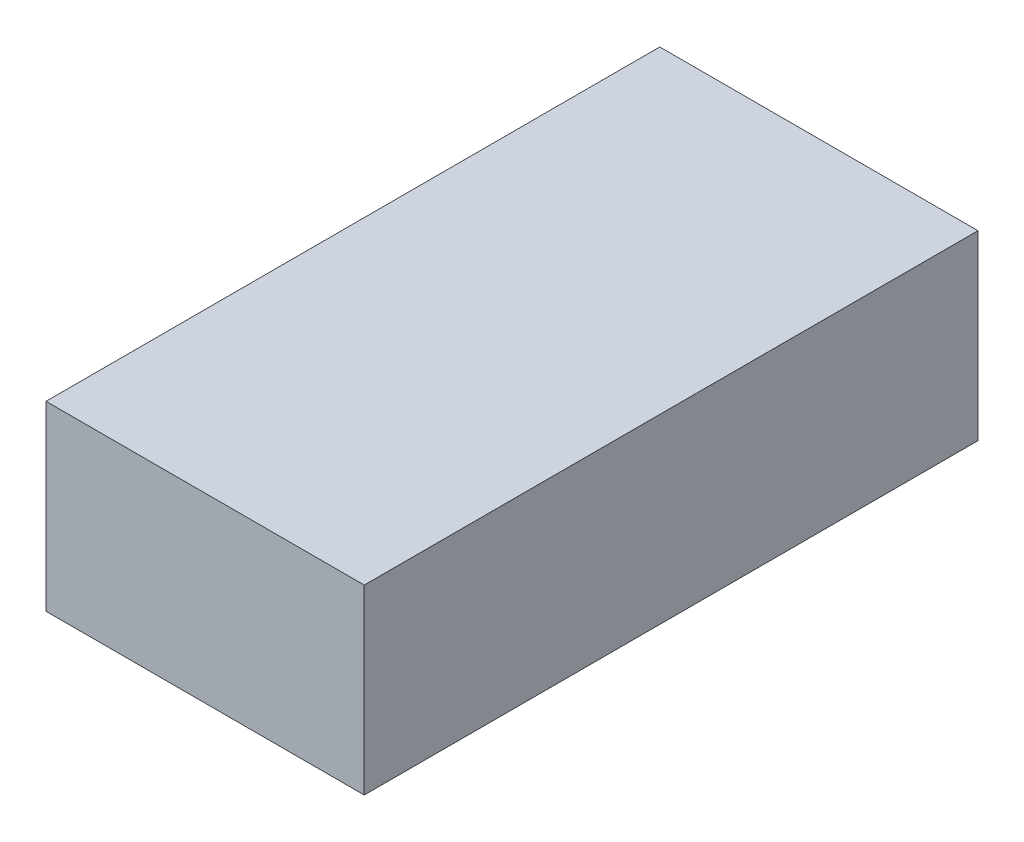
ISO-10303-21;
HEADER;
FILE_DESCRIPTION(('STEP AP214'),'2;1');
FILE_NAME('part.step','',(''),(''),'','','');
FILE_SCHEMA(('AUTOMOTIVE_DESIGN { 1 0 10303 214 1 1 1 1 }'));
ENDSEC;
DATA;
#1=APPLICATION_CONTEXT('core data for automotive mechanical design processes');
#2=APPLICATION_PROTOCOL_DEFINITION('international standard','automotive_design',2000,#1);
#3=PRODUCT_CONTEXT('',#1,'mechanical');
#4=PRODUCT('Part','Part','',(#3));
#5=PRODUCT_RELATED_PRODUCT_CATEGORY('part','',(#4));
#6=PRODUCT_DEFINITION_FORMATION('','',#4);
#7=PRODUCT_DEFINITION_CONTEXT('part definition',#1,'design');
#8=PRODUCT_DEFINITION('design','',#6,#7);
#9=PRODUCT_DEFINITION_SHAPE('','',#8);
#10=(LENGTH_UNIT() NAMED_UNIT(*) SI_UNIT(.MILLI.,.METRE.));
#11=(NAMED_UNIT(*) PLANE_ANGLE_UNIT() SI_UNIT($,.RADIAN.));
#12=(NAMED_UNIT(*) SI_UNIT($,.STERADIAN.) SOLID_ANGLE_UNIT());
#13=UNCERTAINTY_MEASURE_WITH_UNIT(LENGTH_MEASURE(1.E-05),#10,'distance_accuracy_value','');
#14=(GEOMETRIC_REPRESENTATION_CONTEXT(3) GLOBAL_UNCERTAINTY_ASSIGNED_CONTEXT((#13)) GLOBAL_UNIT_ASSIGNED_CONTEXT((#10,
#11,#12)) REPRESENTATION_CONTEXT('',''));
#15=CARTESIAN_POINT('',(0.,0.,0.));
#16=DIRECTION('',(0.,0.,1.));
#17=DIRECTION('',(1.,0.,0.));
#18=AXIS2_PLACEMENT_3D('',#15,#16,#17);
#19=CARTESIAN_POINT('',(-22.225,25.4,-42.8625));
#20=DIRECTION('',(1.,0.,0.));
#21=DIRECTION('',(0.,0.,-1.));
#22=AXIS2_PLACEMENT_3D('',#19,#20,#21);
#23=PLANE('',#22);
#24=DIRECTION('',(0.,0.,1.));
#25=VECTOR('',#24,1.);
#26=CARTESIAN_POINT('',(-22.225,0.,-42.8625));
#27=LINE('',#26,#25);
#28=CARTESIAN_POINT('',(-22.225,0.,-42.8625));
#29=VERTEX_POINT('',#28);
#30=CARTESIAN_POINT('',(-22.225,0.,42.8625));
#31=VERTEX_POINT('',#30);
#32=EDGE_CURVE('E107',#29,#31,#27,.T.);
#33=ORIENTED_EDGE('',*,*,#32,.T.);
#34=DIRECTION('',(0.,-1.,0.));
#35=VECTOR('',#34,1.);
#36=CARTESIAN_POINT('',(-22.225,25.4,42.8625));
#37=LINE('',#36,#35);
#38=CARTESIAN_POINT('',(-22.225,25.4,42.8625));
#39=VERTEX_POINT('',#38);
#40=EDGE_CURVE('E11',#39,#31,#37,.T.);
#41=ORIENTED_EDGE('',*,*,#40,.F.);
#42=DIRECTION('',(0.,0.,1.));
#43=VECTOR('',#42,1.);
#44=CARTESIAN_POINT('',(-22.225,25.4,-42.8625));
#45=LINE('',#44,#43);
#46=CARTESIAN_POINT('',(-22.225,25.4,-42.8625));
#47=VERTEX_POINT('',#46);
#48=EDGE_CURVE('E91',#47,#39,#45,.T.);
#49=ORIENTED_EDGE('',*,*,#48,.F.);
#50=DIRECTION('',(0.,-1.,0.));
#51=VECTOR('',#50,1.);
#52=CARTESIAN_POINT('',(-22.225,25.4,-42.8625));
#53=LINE('',#52,#51);
#54=EDGE_CURVE('E103',#47,#29,#53,.T.);
#55=ORIENTED_EDGE('',*,*,#54,.T.);
#56=EDGE_LOOP('',(#33,#41,#49,#55));
#57=FACE_BOUND('',#56,.T.);
#58=ADVANCED_FACE('F39',(#57),#23,.F.);
#59=CARTESIAN_POINT('',(-22.225,25.4,42.8625));
#60=DIRECTION('',(0.,0.,-1.));
#61=DIRECTION('',(-1.,0.,0.));
#62=AXIS2_PLACEMENT_3D('',#59,#60,#61);
#63=PLANE('',#62);
#64=DIRECTION('',(1.,0.,0.));
#65=VECTOR('',#64,1.);
#66=CARTESIAN_POINT('',(-22.225,0.,42.8625));
#67=LINE('',#66,#65);
#68=CARTESIAN_POINT('',(22.225,0.,42.8625));
#69=VERTEX_POINT('',#68);
#70=EDGE_CURVE('E96',#31,#69,#67,.T.);
#71=ORIENTED_EDGE('',*,*,#70,.T.);
#72=DIRECTION('',(0.,-1.,0.));
#73=VECTOR('',#72,1.);
#74=CARTESIAN_POINT('',(22.225,25.4,42.8625));
#75=LINE('',#74,#73);
#76=CARTESIAN_POINT('',(22.225,25.4,42.8625));
#77=VERTEX_POINT('',#76);
#78=EDGE_CURVE('E48',#77,#69,#75,.T.);
#79=ORIENTED_EDGE('',*,*,#78,.F.);
#80=DIRECTION('',(1.,0.,0.));
#81=VECTOR('',#80,1.);
#82=CARTESIAN_POINT('',(-22.225,25.4,42.8625));
#83=LINE('',#82,#81);
#84=EDGE_CURVE('E86',#39,#77,#83,.T.);
#85=ORIENTED_EDGE('',*,*,#84,.F.);
#86=ORIENTED_EDGE('',*,*,#40,.T.);
#87=EDGE_LOOP('',(#71,#79,#85,#86));
#88=FACE_BOUND('',#87,.T.);
#89=ADVANCED_FACE('F95',(#88),#63,.F.);
#90=CARTESIAN_POINT('',(22.225,25.4,-42.8625));
#91=DIRECTION('',(-1.,0.,0.));
#92=DIRECTION('',(0.,0.,1.));
#93=AXIS2_PLACEMENT_3D('',#90,#91,#92);
#94=PLANE('',#93);
#95=DIRECTION('',(0.,0.,-1.));
#96=VECTOR('',#95,1.);
#97=CARTESIAN_POINT('',(22.225,0.,-42.8625));
#98=LINE('',#97,#96);
#99=CARTESIAN_POINT('',(22.225,0.,-42.8625));
#100=VERTEX_POINT('',#99);
#101=EDGE_CURVE('E73',#69,#100,#98,.T.);
#102=ORIENTED_EDGE('',*,*,#101,.T.);
#103=DIRECTION('',(0.,-1.,0.));
#104=VECTOR('',#103,1.);
#105=CARTESIAN_POINT('',(22.225,25.4,-42.8625));
#106=LINE('',#105,#104);
#107=CARTESIAN_POINT('',(22.225,25.4,-42.8625));
#108=VERTEX_POINT('',#107);
#109=EDGE_CURVE('E98',#108,#100,#106,.T.);
#110=ORIENTED_EDGE('',*,*,#109,.F.);
#111=DIRECTION('',(0.,0.,-1.));
#112=VECTOR('',#111,1.);
#113=CARTESIAN_POINT('',(22.225,25.4,-42.8625));
#114=LINE('',#113,#112);
#115=EDGE_CURVE('E89',#77,#108,#114,.T.);
#116=ORIENTED_EDGE('',*,*,#115,.F.);
#117=ORIENTED_EDGE('',*,*,#78,.T.);
#118=EDGE_LOOP('',(#102,#110,#116,#117));
#119=FACE_BOUND('',#118,.T.);
#120=ADVANCED_FACE('F99',(#119),#94,.F.);
#121=CARTESIAN_POINT('',(-22.225,25.4,-42.8625));
#122=DIRECTION('',(0.,0.,1.));
#123=DIRECTION('',(1.,0.,0.));
#124=AXIS2_PLACEMENT_3D('',#121,#122,#123);
#125=PLANE('',#124);
#126=DIRECTION('',(-1.,0.,0.));
#127=VECTOR('',#126,1.);
#128=CARTESIAN_POINT('',(-22.225,0.,-42.8625));
#129=LINE('',#128,#127);
#130=EDGE_CURVE('E79',#100,#29,#129,.T.);
#131=ORIENTED_EDGE('',*,*,#130,.T.);
#132=ORIENTED_EDGE('',*,*,#54,.F.);
#133=DIRECTION('',(-1.,0.,0.));
#134=VECTOR('',#133,1.);
#135=CARTESIAN_POINT('',(-22.225,25.4,-42.8625));
#136=LINE('',#135,#134);
#137=EDGE_CURVE('E56',#108,#47,#136,.T.);
#138=ORIENTED_EDGE('',*,*,#137,.F.);
#139=ORIENTED_EDGE('',*,*,#109,.T.);
#140=EDGE_LOOP('',(#131,#132,#138,#139));
#141=FACE_BOUND('',#140,.T.);
#142=ADVANCED_FACE('F120',(#141),#125,.F.);
#143=CARTESIAN_POINT('',(0.,25.4,0.));
#144=DIRECTION('',(0.,1.,0.));
#145=DIRECTION('',(0.,0.,1.));
#146=AXIS2_PLACEMENT_3D('',#143,#144,#145);
#147=PLANE('',#146);
#148=ORIENTED_EDGE('',*,*,#48,.T.);
#149=ORIENTED_EDGE('',*,*,#84,.T.);
#150=ORIENTED_EDGE('',*,*,#115,.T.);
#151=ORIENTED_EDGE('',*,*,#137,.T.);
#152=EDGE_LOOP('',(#148,#149,#150,#151));
#153=FACE_BOUND('',#152,.T.);
#154=ADVANCED_FACE('F87',(#153),#147,.T.);
#155=CARTESIAN_POINT('',(0.,0.,0.));
#156=DIRECTION('',(0.,1.,0.));
#157=DIRECTION('',(0.,0.,1.));
#158=AXIS2_PLACEMENT_3D('',#155,#156,#157);
#159=PLANE('',#158);
#160=ORIENTED_EDGE('',*,*,#32,.F.);
#161=ORIENTED_EDGE('',*,*,#130,.F.);
#162=ORIENTED_EDGE('',*,*,#101,.F.);
#163=ORIENTED_EDGE('',*,*,#70,.F.);
#164=EDGE_LOOP('',(#160,#161,#162,#163));
#165=FACE_BOUND('',#164,.T.);
#166=ADVANCED_FACE('F123',(#165),#159,.F.);
#167=CLOSED_SHELL('',(#58,#89,#120,#142,#154,#166));
#168=MANIFOLD_SOLID_BREP('B2',#167);
#169=ADVANCED_BREP_SHAPE_REPRESENTATION('',(#18,#168),#14);
#170=SHAPE_DEFINITION_REPRESENTATION(#9,#169);
ENDSEC;
END-ISO-10303-21;
